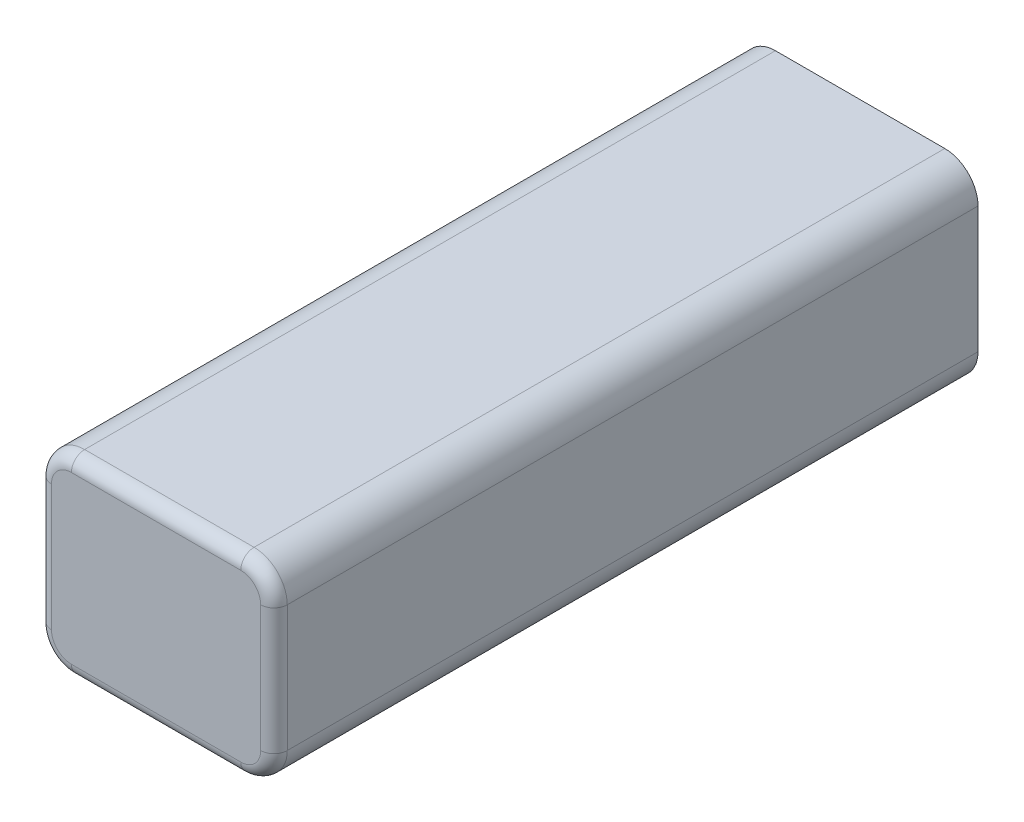
ISO-10303-21;
HEADER;
FILE_DESCRIPTION(('STEP AP214'),'2;1');
FILE_NAME('part.step','',(''),(''),'','','');
FILE_SCHEMA(('AUTOMOTIVE_DESIGN { 1 0 10303 214 1 1 1 1 }'));
ENDSEC;
DATA;
#1=APPLICATION_CONTEXT('core data for automotive mechanical design processes');
#2=APPLICATION_PROTOCOL_DEFINITION('international standard','automotive_design',2000,#1);
#3=PRODUCT_CONTEXT('',#1,'mechanical');
#4=PRODUCT('Part','Part','',(#3));
#5=PRODUCT_RELATED_PRODUCT_CATEGORY('part','',(#4));
#6=PRODUCT_DEFINITION_FORMATION('','',#4);
#7=PRODUCT_DEFINITION_CONTEXT('part definition',#1,'design');
#8=PRODUCT_DEFINITION('design','',#6,#7);
#9=PRODUCT_DEFINITION_SHAPE('','',#8);
#10=(LENGTH_UNIT() NAMED_UNIT(*) SI_UNIT(.MILLI.,.METRE.));
#11=(NAMED_UNIT(*) PLANE_ANGLE_UNIT() SI_UNIT($,.RADIAN.));
#12=(NAMED_UNIT(*) SI_UNIT($,.STERADIAN.) SOLID_ANGLE_UNIT());
#13=UNCERTAINTY_MEASURE_WITH_UNIT(LENGTH_MEASURE(1.E-05),#10,'distance_accuracy_value','');
#14=(GEOMETRIC_REPRESENTATION_CONTEXT(3) GLOBAL_UNCERTAINTY_ASSIGNED_CONTEXT((#13)) GLOBAL_UNIT_ASSIGNED_CONTEXT((#10,
#11,#12)) REPRESENTATION_CONTEXT('',''));
#15=CARTESIAN_POINT('',(0.,0.,0.));
#16=DIRECTION('',(0.,0.,1.));
#17=DIRECTION('',(1.,0.,0.));
#18=AXIS2_PLACEMENT_3D('',#15,#16,#17);
#19=CARTESIAN_POINT('',(17.75,14.5,106.));
#20=DIRECTION('',(-1.,0.,0.));
#21=DIRECTION('',(0.,-1.,0.));
#22=AXIS2_PLACEMENT_3D('',#19,#20,#21);
#23=PLANE('',#22);
#24=DIRECTION('',(0.,0.,-1.));
#25=VECTOR('',#24,1.);
#26=CARTESIAN_POINT('',(17.75,9.5,106.));
#27=LINE('',#26,#25);
#28=CARTESIAN_POINT('',(17.75,9.5,0.));
#29=VERTEX_POINT('',#28);
#30=CARTESIAN_POINT('',(17.75,9.5,104.));
#31=VERTEX_POINT('',#30);
#32=EDGE_CURVE('E139',#29,#31,#27,.F.);
#33=ORIENTED_EDGE('',*,*,#32,.T.);
#34=DIRECTION('',(0.,1.,0.));
#35=VECTOR('',#34,1.);
#36=CARTESIAN_POINT('',(17.75,-9.49999999999999,104.));
#37=LINE('',#36,#35);
#38=CARTESIAN_POINT('',(17.75,-9.5,104.));
#39=VERTEX_POINT('',#38);
#40=EDGE_CURVE('E67',#31,#39,#37,.F.);
#41=ORIENTED_EDGE('',*,*,#40,.T.);
#42=DIRECTION('',(0.,0.,-1.));
#43=VECTOR('',#42,1.);
#44=CARTESIAN_POINT('',(17.75,-9.5,106.));
#45=LINE('',#44,#43);
#46=CARTESIAN_POINT('',(17.75,-9.49999999999999,0.));
#47=VERTEX_POINT('',#46);
#48=EDGE_CURVE('E132',#39,#47,#45,.T.);
#49=ORIENTED_EDGE('',*,*,#48,.T.);
#50=DIRECTION('',(0.,1.,0.));
#51=VECTOR('',#50,1.);
#52=CARTESIAN_POINT('',(17.75,14.5,0.));
#53=LINE('',#52,#51);
#54=EDGE_CURVE('E135',#47,#29,#53,.T.);
#55=ORIENTED_EDGE('',*,*,#54,.T.);
#56=EDGE_LOOP('',(#33,#41,#49,#55));
#57=FACE_BOUND('',#56,.T.);
#58=ADVANCED_FACE('F43',(#57),#23,.F.);
#59=CARTESIAN_POINT('',(-17.75,14.5,106.));
#60=DIRECTION('',(0.,-1.,0.));
#61=DIRECTION('',(1.,0.,0.));
#62=AXIS2_PLACEMENT_3D('',#59,#60,#61);
#63=PLANE('',#62);
#64=DIRECTION('',(0.,0.,-1.));
#65=VECTOR('',#64,1.);
#66=CARTESIAN_POINT('',(-12.75,14.5,106.));
#67=LINE('',#66,#65);
#68=CARTESIAN_POINT('',(-12.75,14.5,0.));
#69=VERTEX_POINT('',#68);
#70=CARTESIAN_POINT('',(-12.75,14.5,104.));
#71=VERTEX_POINT('',#70);
#72=EDGE_CURVE('E179',#69,#71,#67,.F.);
#73=ORIENTED_EDGE('',*,*,#72,.T.);
#74=DIRECTION('',(-1.,0.,0.));
#75=VECTOR('',#74,1.);
#76=CARTESIAN_POINT('',(12.75,14.5,104.));
#77=LINE('',#76,#75);
#78=CARTESIAN_POINT('',(12.75,14.5,104.));
#79=VERTEX_POINT('',#78);
#80=EDGE_CURVE('E206',#71,#79,#77,.F.);
#81=ORIENTED_EDGE('',*,*,#80,.T.);
#82=DIRECTION('',(0.,0.,-1.));
#83=VECTOR('',#82,1.);
#84=CARTESIAN_POINT('',(12.75,14.5,106.));
#85=LINE('',#84,#83);
#86=CARTESIAN_POINT('',(12.75,14.5,0.));
#87=VERTEX_POINT('',#86);
#88=EDGE_CURVE('E177',#79,#87,#85,.T.);
#89=ORIENTED_EDGE('',*,*,#88,.T.);
#90=DIRECTION('',(-1.,0.,0.));
#91=VECTOR('',#90,1.);
#92=CARTESIAN_POINT('',(-17.75,14.5,0.));
#93=LINE('',#92,#91);
#94=EDGE_CURVE('E153',#87,#69,#93,.T.);
#95=ORIENTED_EDGE('',*,*,#94,.T.);
#96=EDGE_LOOP('',(#73,#81,#89,#95));
#97=FACE_BOUND('',#96,.T.);
#98=ADVANCED_FACE('F283',(#97),#63,.F.);
#99=CARTESIAN_POINT('',(-17.75,14.5,106.));
#100=DIRECTION('',(1.,0.,0.));
#101=DIRECTION('',(0.,1.,0.));
#102=AXIS2_PLACEMENT_3D('',#99,#100,#101);
#103=PLANE('',#102);
#104=DIRECTION('',(0.,0.,-1.));
#105=VECTOR('',#104,1.);
#106=CARTESIAN_POINT('',(-17.75,-9.5,106.));
#107=LINE('',#106,#105);
#108=CARTESIAN_POINT('',(-17.75,-9.5,0.));
#109=VERTEX_POINT('',#108);
#110=CARTESIAN_POINT('',(-17.75,-9.5,104.));
#111=VERTEX_POINT('',#110);
#112=EDGE_CURVE('E174',#109,#111,#107,.F.);
#113=ORIENTED_EDGE('',*,*,#112,.T.);
#114=DIRECTION('',(0.,-1.,0.));
#115=VECTOR('',#114,1.);
#116=CARTESIAN_POINT('',(-17.75,9.5,104.));
#117=LINE('',#116,#115);
#118=CARTESIAN_POINT('',(-17.75,9.5,104.));
#119=VERTEX_POINT('',#118);
#120=EDGE_CURVE('E202',#111,#119,#117,.F.);
#121=ORIENTED_EDGE('',*,*,#120,.T.);
#122=DIRECTION('',(0.,0.,-1.));
#123=VECTOR('',#122,1.);
#124=CARTESIAN_POINT('',(-17.75,9.5,106.));
#125=LINE('',#124,#123);
#126=CARTESIAN_POINT('',(-17.75,9.5,0.));
#127=VERTEX_POINT('',#126);
#128=EDGE_CURVE('E172',#119,#127,#125,.T.);
#129=ORIENTED_EDGE('',*,*,#128,.T.);
#130=DIRECTION('',(0.,-1.,0.));
#131=VECTOR('',#130,1.);
#132=CARTESIAN_POINT('',(-17.75,14.5,0.));
#133=LINE('',#132,#131);
#134=EDGE_CURVE('E156',#127,#109,#133,.T.);
#135=ORIENTED_EDGE('',*,*,#134,.T.);
#136=EDGE_LOOP('',(#113,#121,#129,#135));
#137=FACE_BOUND('',#136,.T.);
#138=ADVANCED_FACE('F268',(#137),#103,.F.);
#139=CARTESIAN_POINT('',(-17.75,-14.5,106.));
#140=DIRECTION('',(0.,1.,0.));
#141=DIRECTION('',(0.,0.,1.));
#142=AXIS2_PLACEMENT_3D('',#139,#140,#141);
#143=PLANE('',#142);
#144=DIRECTION('',(0.,0.,-1.));
#145=VECTOR('',#144,1.);
#146=CARTESIAN_POINT('',(12.75,-14.5,106.));
#147=LINE('',#146,#145);
#148=CARTESIAN_POINT('',(12.75,-14.5,0.));
#149=VERTEX_POINT('',#148);
#150=CARTESIAN_POINT('',(12.75,-14.5,104.));
#151=VERTEX_POINT('',#150);
#152=EDGE_CURVE('E143',#149,#151,#147,.F.);
#153=ORIENTED_EDGE('',*,*,#152,.T.);
#154=DIRECTION('',(1.,0.,0.));
#155=VECTOR('',#154,1.);
#156=CARTESIAN_POINT('',(-12.75,-14.5,104.));
#157=LINE('',#156,#155);
#158=CARTESIAN_POINT('',(-12.75,-14.5,104.));
#159=VERTEX_POINT('',#158);
#160=EDGE_CURVE('E11',#151,#159,#157,.F.);
#161=ORIENTED_EDGE('',*,*,#160,.T.);
#162=DIRECTION('',(0.,0.,-1.));
#163=VECTOR('',#162,1.);
#164=CARTESIAN_POINT('',(-12.75,-14.5,106.));
#165=LINE('',#164,#163);
#166=CARTESIAN_POINT('',(-12.75,-14.5,0.));
#167=VERTEX_POINT('',#166);
#168=EDGE_CURVE('E147',#159,#167,#165,.T.);
#169=ORIENTED_EDGE('',*,*,#168,.T.);
#170=DIRECTION('',(1.,0.,0.));
#171=VECTOR('',#170,1.);
#172=CARTESIAN_POINT('',(-17.75,-14.5,0.));
#173=LINE('',#172,#171);
#174=EDGE_CURVE('E163',#167,#149,#173,.T.);
#175=ORIENTED_EDGE('',*,*,#174,.T.);
#176=EDGE_LOOP('',(#153,#161,#169,#175));
#177=FACE_BOUND('',#176,.T.);
#178=ADVANCED_FACE('F251',(#177),#143,.F.);
#179=CARTESIAN_POINT('',(0.,0.,106.));
#180=DIRECTION('',(0.,0.,1.));
#181=DIRECTION('',(1.,0.,0.));
#182=AXIS2_PLACEMENT_3D('',#179,#180,#181);
#183=PLANE('',#182);
#184=DIRECTION('',(0.,-1.,0.));
#185=VECTOR('',#184,1.);
#186=CARTESIAN_POINT('',(-15.75,-9.5,106.));
#187=LINE('',#186,#185);
#188=CARTESIAN_POINT('',(-15.75,9.5,106.));
#189=VERTEX_POINT('',#188);
#190=CARTESIAN_POINT('',(-15.75,-9.5,106.));
#191=VERTEX_POINT('',#190);
#192=EDGE_CURVE('E194',#189,#191,#187,.T.);
#193=ORIENTED_EDGE('',*,*,#192,.T.);
#194=CARTESIAN_POINT('',(-12.75,-9.5,106.));
#195=DIRECTION('',(0.,0.,1.));
#196=DIRECTION('',(1.,0.,0.));
#197=AXIS2_PLACEMENT_3D('',#194,#195,#196);
#198=CIRCLE('',#197,3.);
#199=CARTESIAN_POINT('',(-12.75,-12.5,106.));
#200=VERTEX_POINT('',#199);
#201=EDGE_CURVE('E196',#191,#200,#198,.T.);
#202=ORIENTED_EDGE('',*,*,#201,.T.);
#203=DIRECTION('',(1.,0.,0.));
#204=VECTOR('',#203,1.);
#205=CARTESIAN_POINT('',(12.75,-12.5,106.));
#206=LINE('',#205,#204);
#207=CARTESIAN_POINT('',(12.75,-12.5,106.));
#208=VERTEX_POINT('',#207);
#209=EDGE_CURVE('E182',#200,#208,#206,.T.);
#210=ORIENTED_EDGE('',*,*,#209,.T.);
#211=CARTESIAN_POINT('',(12.75,-9.5,106.));
#212=DIRECTION('',(0.,0.,1.));
#213=DIRECTION('',(1.,0.,0.));
#214=AXIS2_PLACEMENT_3D('',#211,#212,#213);
#215=CIRCLE('',#214,3.);
#216=CARTESIAN_POINT('',(15.75,-9.5,106.));
#217=VERTEX_POINT('',#216);
#218=EDGE_CURVE('E184',#208,#217,#215,.T.);
#219=ORIENTED_EDGE('',*,*,#218,.T.);
#220=DIRECTION('',(0.,1.,0.));
#221=VECTOR('',#220,1.);
#222=CARTESIAN_POINT('',(15.75,9.5,106.));
#223=LINE('',#222,#221);
#224=CARTESIAN_POINT('',(15.75,9.5,106.));
#225=VERTEX_POINT('',#224);
#226=EDGE_CURVE('E186',#217,#225,#223,.T.);
#227=ORIENTED_EDGE('',*,*,#226,.T.);
#228=CARTESIAN_POINT('',(12.75,9.5,106.));
#229=DIRECTION('',(0.,0.,1.));
#230=DIRECTION('',(1.,0.,0.));
#231=AXIS2_PLACEMENT_3D('',#228,#229,#230);
#232=CIRCLE('',#231,3.);
#233=CARTESIAN_POINT('',(12.75,12.5,106.));
#234=VERTEX_POINT('',#233);
#235=EDGE_CURVE('E188',#225,#234,#232,.T.);
#236=ORIENTED_EDGE('',*,*,#235,.T.);
#237=DIRECTION('',(-1.,0.,0.));
#238=VECTOR('',#237,1.);
#239=CARTESIAN_POINT('',(-12.75,12.5,106.));
#240=LINE('',#239,#238);
#241=CARTESIAN_POINT('',(-12.75,12.5,106.));
#242=VERTEX_POINT('',#241);
#243=EDGE_CURVE('E190',#234,#242,#240,.T.);
#244=ORIENTED_EDGE('',*,*,#243,.T.);
#245=CARTESIAN_POINT('',(-12.75,9.5,106.));
#246=DIRECTION('',(0.,0.,1.));
#247=DIRECTION('',(1.,0.,0.));
#248=AXIS2_PLACEMENT_3D('',#245,#246,#247);
#249=CIRCLE('',#248,3.);
#250=EDGE_CURVE('E192',#242,#189,#249,.T.);
#251=ORIENTED_EDGE('',*,*,#250,.T.);
#252=EDGE_LOOP('',(#193,#202,#210,#219,#227,#236,#244,#251));
#253=FACE_BOUND('',#252,.T.);
#254=ADVANCED_FACE('F238',(#253),#183,.T.);
#255=CARTESIAN_POINT('',(0.,0.,0.));
#256=DIRECTION('',(0.,0.,1.));
#257=DIRECTION('',(1.,0.,0.));
#258=AXIS2_PLACEMENT_3D('',#255,#256,#257);
#259=PLANE('',#258);
#260=ORIENTED_EDGE('',*,*,#54,.F.);
#261=CARTESIAN_POINT('',(12.75,-9.5,0.));
#262=DIRECTION('',(0.,0.,1.));
#263=DIRECTION('',(1.,0.,0.));
#264=AXIS2_PLACEMENT_3D('',#261,#262,#263);
#265=CIRCLE('',#264,5.);
#266=EDGE_CURVE('E141',#47,#149,#265,.F.);
#267=ORIENTED_EDGE('',*,*,#266,.T.);
#268=ORIENTED_EDGE('',*,*,#174,.F.);
#269=CARTESIAN_POINT('',(-12.75,-9.5,0.));
#270=DIRECTION('',(0.,0.,1.));
#271=DIRECTION('',(1.,0.,0.));
#272=AXIS2_PLACEMENT_3D('',#269,#270,#271);
#273=CIRCLE('',#272,5.);
#274=EDGE_CURVE('E148',#167,#109,#273,.F.);
#275=ORIENTED_EDGE('',*,*,#274,.T.);
#276=ORIENTED_EDGE('',*,*,#134,.F.);
#277=CARTESIAN_POINT('',(-12.75,9.5,0.));
#278=DIRECTION('',(0.,0.,1.));
#279=DIRECTION('',(1.,0.,0.));
#280=AXIS2_PLACEMENT_3D('',#277,#278,#279);
#281=CIRCLE('',#280,5.);
#282=EDGE_CURVE('E167',#127,#69,#281,.F.);
#283=ORIENTED_EDGE('',*,*,#282,.T.);
#284=ORIENTED_EDGE('',*,*,#94,.F.);
#285=CARTESIAN_POINT('',(12.75,9.5,0.));
#286=DIRECTION('',(0.,0.,1.));
#287=DIRECTION('',(1.,0.,0.));
#288=AXIS2_PLACEMENT_3D('',#285,#286,#287);
#289=CIRCLE('',#288,5.);
#290=EDGE_CURVE('E138',#87,#29,#289,.F.);
#291=ORIENTED_EDGE('',*,*,#290,.T.);
#292=EDGE_LOOP('',(#260,#267,#268,#275,#276,#283,#284,#291));
#293=FACE_BOUND('',#292,.T.);
#294=ADVANCED_FACE('F150',(#293),#259,.F.);
#295=CARTESIAN_POINT('',(12.75,-9.5,106.));
#296=DIRECTION('',(0.,0.,-1.));
#297=DIRECTION('',(-1.,0.,0.));
#298=AXIS2_PLACEMENT_3D('',#295,#296,#297);
#299=CYLINDRICAL_SURFACE('',#298,5.);
#300=ORIENTED_EDGE('',*,*,#48,.F.);
#301=CARTESIAN_POINT('',(12.75,-9.5,104.));
#302=DIRECTION('',(0.,0.,1.));
#303=DIRECTION('',(1.,0.,0.));
#304=AXIS2_PLACEMENT_3D('',#301,#302,#303);
#305=CIRCLE('',#304,5.);
#306=EDGE_CURVE('E52',#39,#151,#305,.F.);
#307=ORIENTED_EDGE('',*,*,#306,.T.);
#308=ORIENTED_EDGE('',*,*,#152,.F.);
#309=ORIENTED_EDGE('',*,*,#266,.F.);
#310=EDGE_LOOP('',(#300,#307,#308,#309));
#311=FACE_BOUND('',#310,.T.);
#312=ADVANCED_FACE('F142',(#311),#299,.T.);
#313=CARTESIAN_POINT('',(-12.75,-9.5,106.));
#314=DIRECTION('',(0.,0.,-1.));
#315=DIRECTION('',(-1.,0.,0.));
#316=AXIS2_PLACEMENT_3D('',#313,#314,#315);
#317=CYLINDRICAL_SURFACE('',#316,5.);
#318=ORIENTED_EDGE('',*,*,#168,.F.);
#319=CARTESIAN_POINT('',(-12.75,-9.5,104.));
#320=DIRECTION('',(0.,0.,1.));
#321=DIRECTION('',(1.,0.,0.));
#322=AXIS2_PLACEMENT_3D('',#319,#320,#321);
#323=CIRCLE('',#322,5.);
#324=EDGE_CURVE('E199',#159,#111,#323,.F.);
#325=ORIENTED_EDGE('',*,*,#324,.T.);
#326=ORIENTED_EDGE('',*,*,#112,.F.);
#327=ORIENTED_EDGE('',*,*,#274,.F.);
#328=EDGE_LOOP('',(#318,#325,#326,#327));
#329=FACE_BOUND('',#328,.T.);
#330=ADVANCED_FACE('F255',(#329),#317,.T.);
#331=CARTESIAN_POINT('',(-12.75,9.5,106.));
#332=DIRECTION('',(0.,0.,-1.));
#333=DIRECTION('',(-1.,0.,0.));
#334=AXIS2_PLACEMENT_3D('',#331,#332,#333);
#335=CYLINDRICAL_SURFACE('',#334,5.);
#336=ORIENTED_EDGE('',*,*,#128,.F.);
#337=CARTESIAN_POINT('',(-12.75,9.5,104.));
#338=DIRECTION('',(0.,0.,1.));
#339=DIRECTION('',(1.,0.,0.));
#340=AXIS2_PLACEMENT_3D('',#337,#338,#339);
#341=CIRCLE('',#340,5.);
#342=EDGE_CURVE('E204',#119,#71,#341,.F.);
#343=ORIENTED_EDGE('',*,*,#342,.T.);
#344=ORIENTED_EDGE('',*,*,#72,.F.);
#345=ORIENTED_EDGE('',*,*,#282,.F.);
#346=EDGE_LOOP('',(#336,#343,#344,#345));
#347=FACE_BOUND('',#346,.T.);
#348=ADVANCED_FACE('F272',(#347),#335,.T.);
#349=CARTESIAN_POINT('',(12.75,9.5,106.));
#350=DIRECTION('',(0.,0.,-1.));
#351=DIRECTION('',(-1.,0.,0.));
#352=AXIS2_PLACEMENT_3D('',#349,#350,#351);
#353=CYLINDRICAL_SURFACE('',#352,5.);
#354=ORIENTED_EDGE('',*,*,#88,.F.);
#355=CARTESIAN_POINT('',(12.75,9.5,104.));
#356=DIRECTION('',(0.,0.,1.));
#357=DIRECTION('',(1.,0.,0.));
#358=AXIS2_PLACEMENT_3D('',#355,#356,#357);
#359=CIRCLE('',#358,5.);
#360=EDGE_CURVE('E208',#79,#31,#359,.F.);
#361=ORIENTED_EDGE('',*,*,#360,.T.);
#362=ORIENTED_EDGE('',*,*,#32,.F.);
#363=ORIENTED_EDGE('',*,*,#290,.F.);
#364=EDGE_LOOP('',(#354,#361,#362,#363));
#365=FACE_BOUND('',#364,.T.);
#366=ADVANCED_FACE('F285',(#365),#353,.T.);
#367=CARTESIAN_POINT('',(12.75,9.5,104.));
#368=DIRECTION('',(0.,0.,1.));
#369=DIRECTION('',(1.,0.,0.));
#370=AXIS2_PLACEMENT_3D('',#367,#368,#369);
#371=TOROIDAL_SURFACE('',#370,3.,2.);
#372=CARTESIAN_POINT('',(15.75,9.5,104.));
#373=DIRECTION('',(0.,-1.,0.));
#374=DIRECTION('',(0.,0.,-1.));
#375=AXIS2_PLACEMENT_3D('',#372,#373,#374);
#376=CIRCLE('',#375,2.);
#377=EDGE_CURVE('E159',#31,#225,#376,.T.);
#378=ORIENTED_EDGE('',*,*,#377,.F.);
#379=ORIENTED_EDGE('',*,*,#360,.F.);
#380=CARTESIAN_POINT('',(12.75,12.5,104.));
#381=DIRECTION('',(-1.,0.,0.));
#382=DIRECTION('',(0.,0.,1.));
#383=AXIS2_PLACEMENT_3D('',#380,#381,#382);
#384=CIRCLE('',#383,2.);
#385=EDGE_CURVE('E47',#234,#79,#384,.T.);
#386=ORIENTED_EDGE('',*,*,#385,.F.);
#387=ORIENTED_EDGE('',*,*,#235,.F.);
#388=EDGE_LOOP('',(#378,#379,#386,#387));
#389=FACE_BOUND('',#388,.T.);
#390=ADVANCED_FACE('F45',(#389),#371,.T.);
#391=CARTESIAN_POINT('',(0.,12.5,104.));
#392=DIRECTION('',(1.,0.,0.));
#393=DIRECTION('',(0.,1.,0.));
#394=AXIS2_PLACEMENT_3D('',#391,#392,#393);
#395=CYLINDRICAL_SURFACE('',#394,2.);
#396=ORIENTED_EDGE('',*,*,#385,.T.);
#397=ORIENTED_EDGE('',*,*,#80,.F.);
#398=CARTESIAN_POINT('',(-12.75,12.5,104.));
#399=DIRECTION('',(-1.,0.,0.));
#400=DIRECTION('',(0.,0.,1.));
#401=AXIS2_PLACEMENT_3D('',#398,#399,#400);
#402=CIRCLE('',#401,2.);
#403=EDGE_CURVE('E225',#242,#71,#402,.T.);
#404=ORIENTED_EDGE('',*,*,#403,.F.);
#405=ORIENTED_EDGE('',*,*,#243,.F.);
#406=EDGE_LOOP('',(#396,#397,#404,#405));
#407=FACE_BOUND('',#406,.T.);
#408=ADVANCED_FACE('F280',(#407),#395,.T.);
#409=CARTESIAN_POINT('',(15.75,0.,104.));
#410=DIRECTION('',(0.,-1.,0.));
#411=DIRECTION('',(1.,0.,0.));
#412=AXIS2_PLACEMENT_3D('',#409,#410,#411);
#413=CYLINDRICAL_SURFACE('',#412,2.);
#414=ORIENTED_EDGE('',*,*,#377,.T.);
#415=ORIENTED_EDGE('',*,*,#226,.F.);
#416=CARTESIAN_POINT('',(15.75,-9.5,104.));
#417=DIRECTION('',(0.,-1.,0.));
#418=DIRECTION('',(0.,0.,-1.));
#419=AXIS2_PLACEMENT_3D('',#416,#417,#418);
#420=CIRCLE('',#419,2.);
#421=EDGE_CURVE('E222',#39,#217,#420,.T.);
#422=ORIENTED_EDGE('',*,*,#421,.F.);
#423=ORIENTED_EDGE('',*,*,#40,.F.);
#424=EDGE_LOOP('',(#414,#415,#422,#423));
#425=FACE_BOUND('',#424,.T.);
#426=ADVANCED_FACE('F231',(#425),#413,.T.);
#427=CARTESIAN_POINT('',(-12.75,9.5,104.));
#428=DIRECTION('',(0.,0.,1.));
#429=DIRECTION('',(1.,0.,0.));
#430=AXIS2_PLACEMENT_3D('',#427,#428,#429);
#431=TOROIDAL_SURFACE('',#430,3.,2.);
#432=ORIENTED_EDGE('',*,*,#403,.T.);
#433=ORIENTED_EDGE('',*,*,#342,.F.);
#434=CARTESIAN_POINT('',(-15.75,9.5,104.));
#435=DIRECTION('',(0.,-1.,0.));
#436=DIRECTION('',(0.,0.,-1.));
#437=AXIS2_PLACEMENT_3D('',#434,#435,#436);
#438=CIRCLE('',#437,2.);
#439=EDGE_CURVE('E219',#189,#119,#438,.T.);
#440=ORIENTED_EDGE('',*,*,#439,.F.);
#441=ORIENTED_EDGE('',*,*,#250,.F.);
#442=EDGE_LOOP('',(#432,#433,#440,#441));
#443=FACE_BOUND('',#442,.T.);
#444=ADVANCED_FACE('F276',(#443),#431,.T.);
#445=CARTESIAN_POINT('',(12.75,-9.5,104.));
#446=DIRECTION('',(0.,0.,1.));
#447=DIRECTION('',(1.,0.,0.));
#448=AXIS2_PLACEMENT_3D('',#445,#446,#447);
#449=TOROIDAL_SURFACE('',#448,3.,2.);
#450=ORIENTED_EDGE('',*,*,#421,.T.);
#451=ORIENTED_EDGE('',*,*,#218,.F.);
#452=CARTESIAN_POINT('',(12.75,-12.5,104.));
#453=DIRECTION('',(-1.,0.,0.));
#454=DIRECTION('',(0.,0.,1.));
#455=AXIS2_PLACEMENT_3D('',#452,#453,#454);
#456=CIRCLE('',#455,2.);
#457=EDGE_CURVE('E216',#151,#208,#456,.T.);
#458=ORIENTED_EDGE('',*,*,#457,.F.);
#459=ORIENTED_EDGE('',*,*,#306,.F.);
#460=EDGE_LOOP('',(#450,#451,#458,#459));
#461=FACE_BOUND('',#460,.T.);
#462=ADVANCED_FACE('F244',(#461),#449,.T.);
#463=CARTESIAN_POINT('',(-15.75,0.,104.));
#464=DIRECTION('',(0.,1.,0.));
#465=DIRECTION('',(-1.,0.,0.));
#466=AXIS2_PLACEMENT_3D('',#463,#464,#465);
#467=CYLINDRICAL_SURFACE('',#466,2.);
#468=ORIENTED_EDGE('',*,*,#439,.T.);
#469=ORIENTED_EDGE('',*,*,#120,.F.);
#470=CARTESIAN_POINT('',(-15.75,-9.5,104.));
#471=DIRECTION('',(0.,-1.,0.));
#472=DIRECTION('',(0.,0.,-1.));
#473=AXIS2_PLACEMENT_3D('',#470,#471,#472);
#474=CIRCLE('',#473,2.);
#475=EDGE_CURVE('E214',#191,#111,#474,.T.);
#476=ORIENTED_EDGE('',*,*,#475,.F.);
#477=ORIENTED_EDGE('',*,*,#192,.F.);
#478=EDGE_LOOP('',(#468,#469,#476,#477));
#479=FACE_BOUND('',#478,.T.);
#480=ADVANCED_FACE('F264',(#479),#467,.T.);
#481=CARTESIAN_POINT('',(0.,-12.5,104.));
#482=DIRECTION('',(-1.,0.,0.));
#483=DIRECTION('',(0.,0.,1.));
#484=AXIS2_PLACEMENT_3D('',#481,#482,#483);
#485=CYLINDRICAL_SURFACE('',#484,2.);
#486=ORIENTED_EDGE('',*,*,#457,.T.);
#487=ORIENTED_EDGE('',*,*,#209,.F.);
#488=CARTESIAN_POINT('',(-12.75,-12.5,104.));
#489=DIRECTION('',(-1.,0.,0.));
#490=DIRECTION('',(0.,0.,1.));
#491=AXIS2_PLACEMENT_3D('',#488,#489,#490);
#492=CIRCLE('',#491,2.);
#493=EDGE_CURVE('E212',#159,#200,#492,.T.);
#494=ORIENTED_EDGE('',*,*,#493,.F.);
#495=ORIENTED_EDGE('',*,*,#160,.F.);
#496=EDGE_LOOP('',(#486,#487,#494,#495));
#497=FACE_BOUND('',#496,.T.);
#498=ADVANCED_FACE('F247',(#497),#485,.T.);
#499=CARTESIAN_POINT('',(-12.75,-9.5,104.));
#500=DIRECTION('',(0.,0.,1.));
#501=DIRECTION('',(1.,0.,0.));
#502=AXIS2_PLACEMENT_3D('',#499,#500,#501);
#503=TOROIDAL_SURFACE('',#502,3.,2.);
#504=ORIENTED_EDGE('',*,*,#475,.T.);
#505=ORIENTED_EDGE('',*,*,#324,.F.);
#506=ORIENTED_EDGE('',*,*,#493,.T.);
#507=ORIENTED_EDGE('',*,*,#201,.F.);
#508=EDGE_LOOP('',(#504,#505,#506,#507));
#509=FACE_BOUND('',#508,.T.);
#510=ADVANCED_FACE('F258',(#509),#503,.T.);
#511=CLOSED_SHELL('',(#58,#98,#138,#178,#254,#294,#312,#330,#348,#366,#390,#408,#426,#444,#462,
#480,#498,#510));
#512=MANIFOLD_SOLID_BREP('B2',#511);
#513=ADVANCED_BREP_SHAPE_REPRESENTATION('',(#18,#512),#14);
#514=SHAPE_DEFINITION_REPRESENTATION(#9,#513);
ENDSEC;
END-ISO-10303-21;
